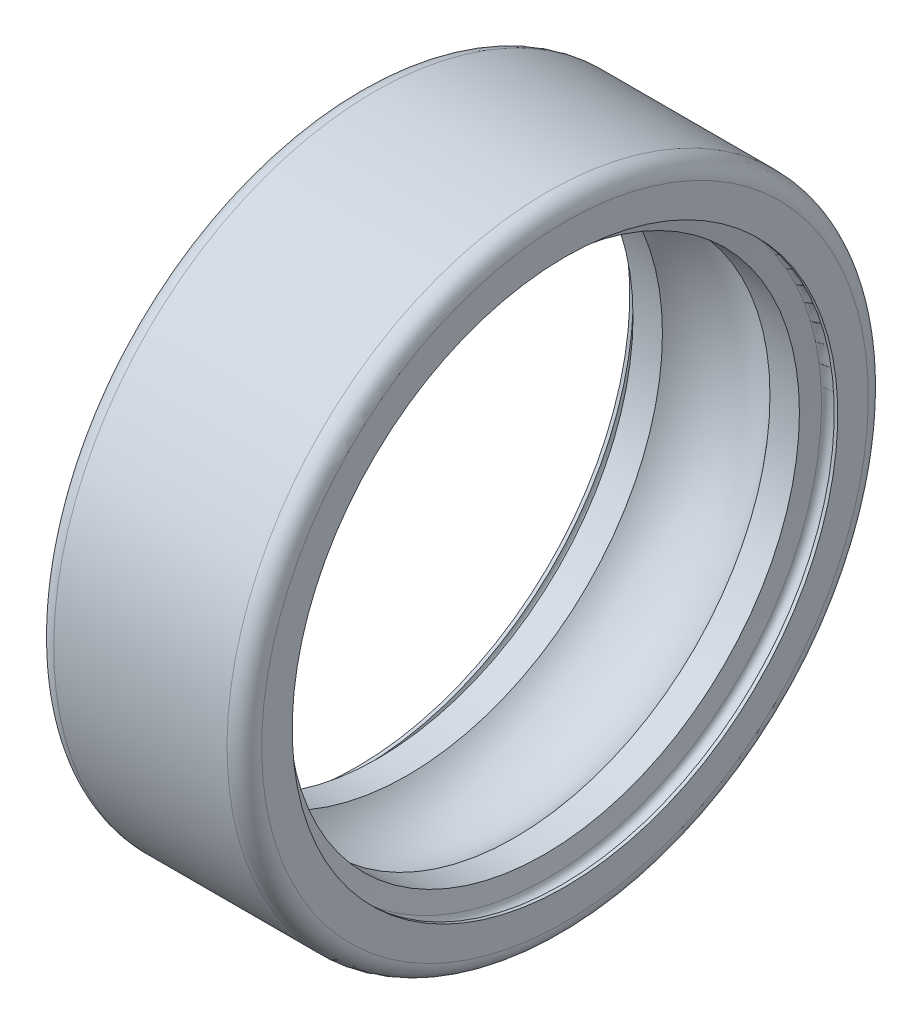
ISO-10303-21;
HEADER;
FILE_DESCRIPTION(('STEP AP214'),'2;1');
FILE_NAME('part.step','',(''),(''),'','','');
FILE_SCHEMA(('AUTOMOTIVE_DESIGN { 1 0 10303 214 1 1 1 1 }'));
ENDSEC;
DATA;
#1=APPLICATION_CONTEXT('core data for automotive mechanical design processes');
#2=APPLICATION_PROTOCOL_DEFINITION('international standard','automotive_design',2000,#1);
#3=PRODUCT_CONTEXT('',#1,'mechanical');
#4=PRODUCT('Part','Part','',(#3));
#5=PRODUCT_RELATED_PRODUCT_CATEGORY('part','',(#4));
#6=PRODUCT_DEFINITION_FORMATION('','',#4);
#7=PRODUCT_DEFINITION_CONTEXT('part definition',#1,'design');
#8=PRODUCT_DEFINITION('design','',#6,#7);
#9=PRODUCT_DEFINITION_SHAPE('','',#8);
#10=(LENGTH_UNIT() NAMED_UNIT(*) SI_UNIT(.MILLI.,.METRE.));
#11=(NAMED_UNIT(*) PLANE_ANGLE_UNIT() SI_UNIT($,.RADIAN.));
#12=(NAMED_UNIT(*) SI_UNIT($,.STERADIAN.) SOLID_ANGLE_UNIT());
#13=UNCERTAINTY_MEASURE_WITH_UNIT(LENGTH_MEASURE(1.E-05),#10,'distance_accuracy_value','');
#14=(GEOMETRIC_REPRESENTATION_CONTEXT(3) GLOBAL_UNCERTAINTY_ASSIGNED_CONTEXT((#13)) GLOBAL_UNIT_ASSIGNED_CONTEXT((#10,
#11,#12)) REPRESENTATION_CONTEXT('',''));
#15=CARTESIAN_POINT('',(0.,0.,0.));
#16=DIRECTION('',(0.,0.,1.));
#17=DIRECTION('',(1.,0.,0.));
#18=AXIS2_PLACEMENT_3D('',#15,#16,#17);
#19=CARTESIAN_POINT('',(11.391,0.,0.));
#20=DIRECTION('',(1.,0.,0.));
#21=DIRECTION('',(0.,0.,-1.));
#22=AXIS2_PLACEMENT_3D('',#19,#20,#21);
#23=TOROIDAL_SURFACE('',#22,15.74,0.406);
#24=CARTESIAN_POINT('',(11.797,0.,0.));
#25=DIRECTION('',(1.,0.,0.));
#26=DIRECTION('',(0.,1.,0.));
#27=AXIS2_PLACEMENT_3D('',#24,#25,#26);
#28=CIRCLE('',#27,15.74);
#29=CARTESIAN_POINT('',(11.797,15.74,0.));
#30=VERTEX_POINT('',#29);
#31=EDGE_CURVE('E11',#30,#30,#28,.T.);
#32=ORIENTED_EDGE('',*,*,#31,.T.);
#33=EDGE_LOOP('',(#32));
#34=FACE_BOUND('',#33,.T.);
#35=CARTESIAN_POINT('',(10.991168052277,0.,0.));
#36=DIRECTION('',(1.,0.,0.));
#37=DIRECTION('',(0.,1.,0.));
#38=AXIS2_PLACEMENT_3D('',#35,#36,#37);
#39=CIRCLE('',#38,15.8105011601328);
#40=CARTESIAN_POINT('',(10.991168052277,15.8105011601328,0.));
#41=VERTEX_POINT('',#40);
#42=EDGE_CURVE('E98',#41,#41,#39,.T.);
#43=ORIENTED_EDGE('',*,*,#42,.F.);
#44=EDGE_LOOP('',(#43));
#45=FACE_BOUND('',#44,.T.);
#46=ADVANCED_FACE('F16',(#34,#45),#23,.F.);
#47=CARTESIAN_POINT('',(11.8985,0.,0.));
#48=DIRECTION('',(-1.,0.,0.));
#49=DIRECTION('',(0.,1.,0.));
#50=AXIS2_PLACEMENT_3D('',#47,#48,#49);
#51=CYLINDRICAL_SURFACE('',#50,15.74);
#52=CARTESIAN_POINT('',(12.,0.,0.));
#53=DIRECTION('',(1.,0.,0.));
#54=DIRECTION('',(0.,1.,0.));
#55=AXIS2_PLACEMENT_3D('',#52,#53,#54);
#56=CIRCLE('',#55,15.74);
#57=CARTESIAN_POINT('',(12.,15.74,0.));
#58=VERTEX_POINT('',#57);
#59=EDGE_CURVE('E26',#58,#58,#56,.T.);
#60=ORIENTED_EDGE('',*,*,#59,.T.);
#61=EDGE_LOOP('',(#60));
#62=FACE_BOUND('',#61,.T.);
#63=ORIENTED_EDGE('',*,*,#31,.F.);
#64=EDGE_LOOP('',(#63));
#65=FACE_BOUND('',#64,.T.);
#66=ADVANCED_FACE('F138',(#62,#65),#51,.F.);
#67=CARTESIAN_POINT('',(12.,16.62,0.));
#68=DIRECTION('',(1.,0.,0.));
#69=DIRECTION('',(0.,1.,0.));
#70=AXIS2_PLACEMENT_3D('',#67,#68,#69);
#71=PLANE('',#70);
#72=CARTESIAN_POINT('',(12.,0.,0.));
#73=DIRECTION('',(1.,0.,0.));
#74=DIRECTION('',(0.,1.,0.));
#75=AXIS2_PLACEMENT_3D('',#72,#73,#74);
#76=CIRCLE('',#75,17.5);
#77=CARTESIAN_POINT('',(12.,17.5,0.));
#78=VERTEX_POINT('',#77);
#79=EDGE_CURVE('E92',#78,#78,#76,.T.);
#80=ORIENTED_EDGE('',*,*,#79,.T.);
#81=EDGE_LOOP('',(#80));
#82=FACE_BOUND('',#81,.T.);
#83=ORIENTED_EDGE('',*,*,#59,.F.);
#84=EDGE_LOOP('',(#83));
#85=FACE_BOUND('',#84,.T.);
#86=ADVANCED_FACE('F142',(#82,#85),#71,.T.);
#87=CARTESIAN_POINT('',(11.,0.,0.));
#88=DIRECTION('',(1.,0.,0.));
#89=DIRECTION('',(0.,0.,-1.));
#90=AXIS2_PLACEMENT_3D('',#87,#88,#89);
#91=TOROIDAL_SURFACE('',#90,17.5,1.);
#92=CARTESIAN_POINT('',(11.,0.,0.));
#93=DIRECTION('',(1.,0.,0.));
#94=DIRECTION('',(0.,1.,0.));
#95=AXIS2_PLACEMENT_3D('',#92,#93,#94);
#96=CIRCLE('',#95,18.5);
#97=CARTESIAN_POINT('',(11.,18.5,0.));
#98=VERTEX_POINT('',#97);
#99=EDGE_CURVE('E94',#98,#98,#96,.T.);
#100=ORIENTED_EDGE('',*,*,#99,.T.);
#101=EDGE_LOOP('',(#100));
#102=FACE_BOUND('',#101,.T.);
#103=ORIENTED_EDGE('',*,*,#79,.F.);
#104=EDGE_LOOP('',(#103));
#105=FACE_BOUND('',#104,.T.);
#106=ADVANCED_FACE('F133',(#102,#105),#91,.T.);
#107=CARTESIAN_POINT('',(6.,0.,0.));
#108=DIRECTION('',(-1.,0.,0.));
#109=DIRECTION('',(0.,1.,0.));
#110=AXIS2_PLACEMENT_3D('',#107,#108,#109);
#111=CYLINDRICAL_SURFACE('',#110,18.5);
#112=CARTESIAN_POINT('',(1.,0.,0.));
#113=DIRECTION('',(1.,0.,0.));
#114=DIRECTION('',(0.,1.,0.));
#115=AXIS2_PLACEMENT_3D('',#112,#113,#114);
#116=CIRCLE('',#115,18.5);
#117=CARTESIAN_POINT('',(1.,18.5,0.));
#118=VERTEX_POINT('',#117);
#119=EDGE_CURVE('E20',#118,#118,#116,.T.);
#120=ORIENTED_EDGE('',*,*,#119,.T.);
#121=EDGE_LOOP('',(#120));
#122=FACE_BOUND('',#121,.T.);
#123=ORIENTED_EDGE('',*,*,#99,.F.);
#124=EDGE_LOOP('',(#123));
#125=FACE_BOUND('',#124,.T.);
#126=ADVANCED_FACE('F118',(#122,#125),#111,.T.);
#127=CARTESIAN_POINT('',(1.,0.,0.));
#128=DIRECTION('',(1.,0.,0.));
#129=DIRECTION('',(0.,0.,-1.));
#130=AXIS2_PLACEMENT_3D('',#127,#128,#129);
#131=TOROIDAL_SURFACE('',#130,17.5,1.);
#132=CARTESIAN_POINT('',(0.,0.,0.));
#133=DIRECTION('',(1.,0.,0.));
#134=DIRECTION('',(0.,1.,0.));
#135=AXIS2_PLACEMENT_3D('',#132,#133,#134);
#136=CIRCLE('',#135,17.5);
#137=CARTESIAN_POINT('',(0.,17.5,0.));
#138=VERTEX_POINT('',#137);
#139=EDGE_CURVE('E83',#138,#138,#136,.T.);
#140=ORIENTED_EDGE('',*,*,#139,.T.);
#141=EDGE_LOOP('',(#140));
#142=FACE_BOUND('',#141,.T.);
#143=ORIENTED_EDGE('',*,*,#119,.F.);
#144=EDGE_LOOP('',(#143));
#145=FACE_BOUND('',#144,.T.);
#146=ADVANCED_FACE('F121',(#142,#145),#131,.T.);
#147=CARTESIAN_POINT('',(0.,16.62,0.));
#148=DIRECTION('',(-1.,0.,0.));
#149=DIRECTION('',(0.,-1.,0.));
#150=AXIS2_PLACEMENT_3D('',#147,#148,#149);
#151=PLANE('',#150);
#152=CARTESIAN_POINT('',(0.,0.,0.));
#153=DIRECTION('',(1.,0.,0.));
#154=DIRECTION('',(0.,1.,0.));
#155=AXIS2_PLACEMENT_3D('',#152,#153,#154);
#156=CIRCLE('',#155,15.74);
#157=CARTESIAN_POINT('',(0.,15.74,0.));
#158=VERTEX_POINT('',#157);
#159=EDGE_CURVE('E76',#158,#158,#156,.T.);
#160=ORIENTED_EDGE('',*,*,#159,.T.);
#161=EDGE_LOOP('',(#160));
#162=FACE_BOUND('',#161,.T.);
#163=ORIENTED_EDGE('',*,*,#139,.F.);
#164=EDGE_LOOP('',(#163));
#165=FACE_BOUND('',#164,.T.);
#166=ADVANCED_FACE('F123',(#162,#165),#151,.T.);
#167=CARTESIAN_POINT('',(0.1015,0.,0.));
#168=DIRECTION('',(-1.,0.,0.));
#169=DIRECTION('',(0.,1.,0.));
#170=AXIS2_PLACEMENT_3D('',#167,#168,#169);
#171=CYLINDRICAL_SURFACE('',#170,15.74);
#172=CARTESIAN_POINT('',(0.203,0.,0.));
#173=DIRECTION('',(1.,0.,0.));
#174=DIRECTION('',(0.,1.,0.));
#175=AXIS2_PLACEMENT_3D('',#172,#173,#174);
#176=CIRCLE('',#175,15.74);
#177=CARTESIAN_POINT('',(0.203,15.74,0.));
#178=VERTEX_POINT('',#177);
#179=EDGE_CURVE('E71',#178,#178,#176,.T.);
#180=ORIENTED_EDGE('',*,*,#179,.T.);
#181=EDGE_LOOP('',(#180));
#182=FACE_BOUND('',#181,.T.);
#183=ORIENTED_EDGE('',*,*,#159,.F.);
#184=EDGE_LOOP('',(#183));
#185=FACE_BOUND('',#184,.T.);
#186=ADVANCED_FACE('F72',(#182,#185),#171,.F.);
#187=CARTESIAN_POINT('',(0.609,0.,0.));
#188=DIRECTION('',(1.,0.,0.));
#189=DIRECTION('',(0.,0.,-1.));
#190=AXIS2_PLACEMENT_3D('',#187,#188,#189);
#191=TOROIDAL_SURFACE('',#190,15.74,0.406);
#192=CARTESIAN_POINT('',(1.00883194772296,0.,0.));
#193=DIRECTION('',(1.,0.,0.));
#194=DIRECTION('',(0.,1.,0.));
#195=AXIS2_PLACEMENT_3D('',#192,#193,#194);
#196=CIRCLE('',#195,15.8105011601328);
#197=CARTESIAN_POINT('',(1.00883194772296,15.8105011601328,0.));
#198=VERTEX_POINT('',#197);
#199=EDGE_CURVE('E77',#198,#198,#196,.T.);
#200=ORIENTED_EDGE('',*,*,#199,.T.);
#201=EDGE_LOOP('',(#200));
#202=FACE_BOUND('',#201,.T.);
#203=ORIENTED_EDGE('',*,*,#179,.F.);
#204=EDGE_LOOP('',(#203));
#205=FACE_BOUND('',#204,.T.);
#206=ADVANCED_FACE('F18',(#202,#205),#191,.F.);
#207=CARTESIAN_POINT('',(1.10453351878383,0.,0.));
#208=DIRECTION('',(-1.,0.,0.));
#209=DIRECTION('',(0.,1.,0.));
#210=AXIS2_PLACEMENT_3D('',#207,#208,#209);
#211=CONICAL_SURFACE('',#210,15.2677505800664,1.39626340159546);
#212=CARTESIAN_POINT('',(1.2002350898447,0.,0.));
#213=DIRECTION('',(1.,0.,0.));
#214=DIRECTION('',(0.,1.,0.));
#215=AXIS2_PLACEMENT_3D('',#212,#213,#214);
#216=CIRCLE('',#215,14.725);
#217=CARTESIAN_POINT('',(1.2002350898447,14.725,0.));
#218=VERTEX_POINT('',#217);
#219=EDGE_CURVE('E86',#218,#218,#216,.T.);
#220=ORIENTED_EDGE('',*,*,#219,.T.);
#221=EDGE_LOOP('',(#220));
#222=FACE_BOUND('',#221,.T.);
#223=ORIENTED_EDGE('',*,*,#199,.F.);
#224=EDGE_LOOP('',(#223));
#225=FACE_BOUND('',#224,.T.);
#226=ADVANCED_FACE('F167',(#222,#225),#211,.F.);
#227=CARTESIAN_POINT('',(2.04872011034925,0.,0.));
#228=DIRECTION('',(-1.,0.,0.));
#229=DIRECTION('',(0.,1.,0.));
#230=AXIS2_PLACEMENT_3D('',#227,#228,#229);
#231=CYLINDRICAL_SURFACE('',#230,14.725);
#232=CARTESIAN_POINT('',(2.8972051308538,0.,0.));
#233=DIRECTION('',(1.,0.,0.));
#234=DIRECTION('',(0.,1.,0.));
#235=AXIS2_PLACEMENT_3D('',#232,#233,#234);
#236=CIRCLE('',#235,14.725);
#237=CARTESIAN_POINT('',(2.8972051308538,14.725,0.));
#238=VERTEX_POINT('',#237);
#239=EDGE_CURVE('E90',#238,#238,#236,.T.);
#240=ORIENTED_EDGE('',*,*,#239,.T.);
#241=EDGE_LOOP('',(#240));
#242=FACE_BOUND('',#241,.T.);
#243=ORIENTED_EDGE('',*,*,#219,.F.);
#244=EDGE_LOOP('',(#243));
#245=FACE_BOUND('',#244,.T.);
#246=ADVANCED_FACE('F165',(#242,#245),#231,.F.);
#247=CARTESIAN_POINT('',(6.,0.,0.));
#248=DIRECTION('',(1.,0.,0.));
#249=DIRECTION('',(0.,0.,-1.));
#250=AXIS2_PLACEMENT_3D('',#247,#248,#249);
#251=TOROIDAL_SURFACE('',#250,12.25,3.969);
#252=CARTESIAN_POINT('',(9.1027948691462,0.,0.));
#253=DIRECTION('',(1.,0.,0.));
#254=DIRECTION('',(0.,1.,0.));
#255=AXIS2_PLACEMENT_3D('',#252,#253,#254);
#256=CIRCLE('',#255,14.725);
#257=CARTESIAN_POINT('',(9.1027948691462,14.725,0.));
#258=VERTEX_POINT('',#257);
#259=EDGE_CURVE('E100',#258,#258,#256,.T.);
#260=ORIENTED_EDGE('',*,*,#259,.T.);
#261=EDGE_LOOP('',(#260));
#262=FACE_BOUND('',#261,.T.);
#263=ORIENTED_EDGE('',*,*,#239,.F.);
#264=EDGE_LOOP('',(#263));
#265=FACE_BOUND('',#264,.T.);
#266=ADVANCED_FACE('F158',(#262,#265),#251,.F.);
#267=CARTESIAN_POINT('',(9.95127988965075,0.,0.));
#268=DIRECTION('',(-1.,0.,0.));
#269=DIRECTION('',(0.,1.,0.));
#270=AXIS2_PLACEMENT_3D('',#267,#268,#269);
#271=CYLINDRICAL_SURFACE('',#270,14.725);
#272=CARTESIAN_POINT('',(10.7997649101553,0.,0.));
#273=DIRECTION('',(1.,0.,0.));
#274=DIRECTION('',(0.,1.,0.));
#275=AXIS2_PLACEMENT_3D('',#272,#273,#274);
#276=CIRCLE('',#275,14.725);
#277=CARTESIAN_POINT('',(10.7997649101553,14.725,0.));
#278=VERTEX_POINT('',#277);
#279=EDGE_CURVE('E101',#278,#278,#276,.T.);
#280=ORIENTED_EDGE('',*,*,#279,.T.);
#281=EDGE_LOOP('',(#280));
#282=FACE_BOUND('',#281,.T.);
#283=ORIENTED_EDGE('',*,*,#259,.F.);
#284=EDGE_LOOP('',(#283));
#285=FACE_BOUND('',#284,.T.);
#286=ADVANCED_FACE('F163',(#282,#285),#271,.F.);
#287=CARTESIAN_POINT('',(10.8954664812162,0.,0.));
#288=DIRECTION('',(1.,0.,0.));
#289=DIRECTION('',(0.,1.,0.));
#290=AXIS2_PLACEMENT_3D('',#287,#288,#289);
#291=CONICAL_SURFACE('',#290,15.2677505800664,1.39626340159546);
#292=ORIENTED_EDGE('',*,*,#42,.T.);
#293=EDGE_LOOP('',(#292));
#294=FACE_BOUND('',#293,.T.);
#295=ORIENTED_EDGE('',*,*,#279,.F.);
#296=EDGE_LOOP('',(#295));
#297=FACE_BOUND('',#296,.T.);
#298=ADVANCED_FACE('F160',(#294,#297),#291,.F.);
#299=CLOSED_SHELL('',(#46,#66,#86,#106,#126,#146,#166,#186,#206,#226,#246,#266,#286,#298));
#300=MANIFOLD_SOLID_BREP('B1',#299);
#301=ADVANCED_BREP_SHAPE_REPRESENTATION('',(#18,#300),#14);
#302=SHAPE_DEFINITION_REPRESENTATION(#9,#301);
ENDSEC;
END-ISO-10303-21;
